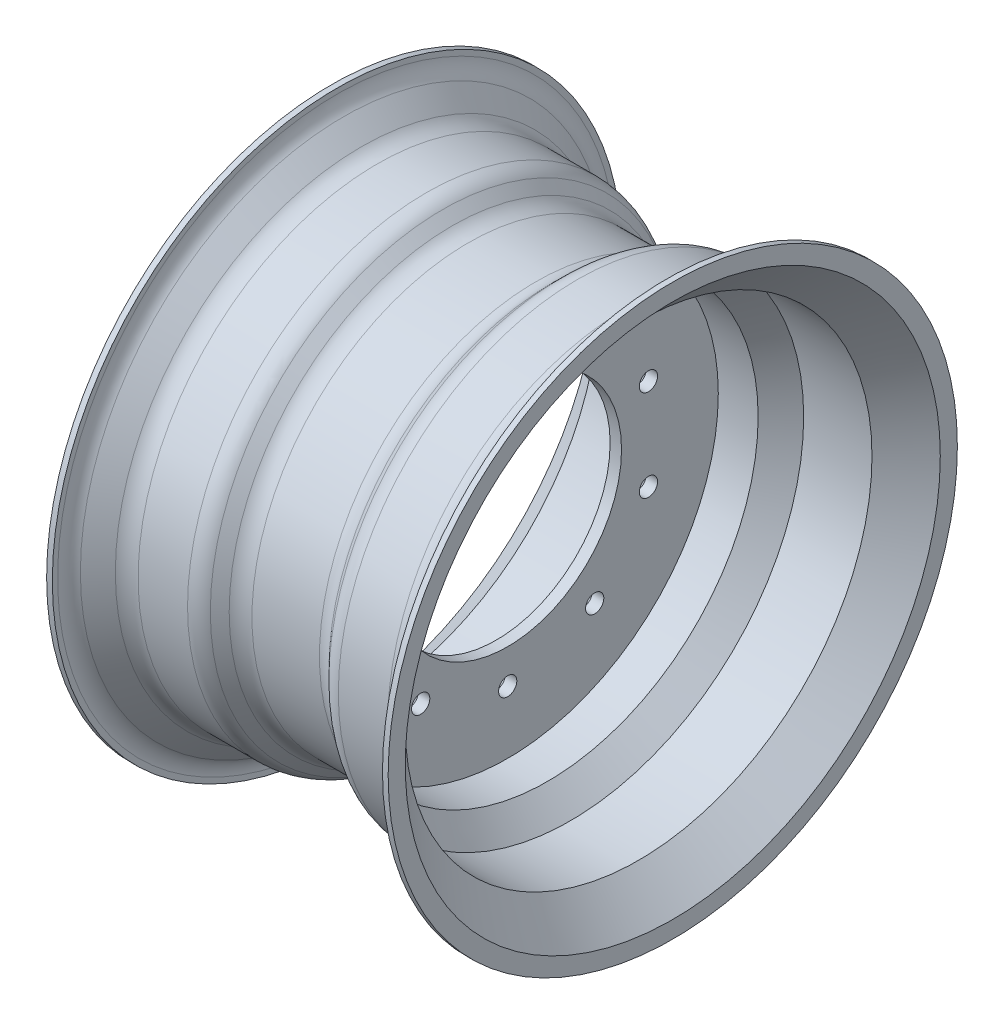
ISO-10303-21;
HEADER;
FILE_DESCRIPTION(('STEP AP214'),'2;1');
FILE_NAME('part.step','',(''),(''),'','','');
FILE_SCHEMA(('AUTOMOTIVE_DESIGN { 1 0 10303 214 1 1 1 1 }'));
ENDSEC;
DATA;
#1=APPLICATION_CONTEXT('core data for automotive mechanical design processes');
#2=APPLICATION_PROTOCOL_DEFINITION('international standard','automotive_design',2000,#1);
#3=PRODUCT_CONTEXT('',#1,'mechanical');
#4=PRODUCT('Part','Part','',(#3));
#5=PRODUCT_RELATED_PRODUCT_CATEGORY('part','',(#4));
#6=PRODUCT_DEFINITION_FORMATION('','',#4);
#7=PRODUCT_DEFINITION_CONTEXT('part definition',#1,'design');
#8=PRODUCT_DEFINITION('design','',#6,#7);
#9=PRODUCT_DEFINITION_SHAPE('','',#8);
#10=(LENGTH_UNIT() NAMED_UNIT(*) SI_UNIT(.MILLI.,.METRE.));
#11=(NAMED_UNIT(*) PLANE_ANGLE_UNIT() SI_UNIT($,.RADIAN.));
#12=(NAMED_UNIT(*) SI_UNIT($,.STERADIAN.) SOLID_ANGLE_UNIT());
#13=UNCERTAINTY_MEASURE_WITH_UNIT(LENGTH_MEASURE(1.E-05),#10,'distance_accuracy_value','');
#14=(GEOMETRIC_REPRESENTATION_CONTEXT(3) GLOBAL_UNCERTAINTY_ASSIGNED_CONTEXT((#13)) GLOBAL_UNIT_ASSIGNED_CONTEXT((#10,
#11,#12)) REPRESENTATION_CONTEXT('',''));
#15=CARTESIAN_POINT('',(0.,0.,0.));
#16=DIRECTION('',(0.,0.,1.));
#17=DIRECTION('',(1.,0.,0.));
#18=AXIS2_PLACEMENT_3D('',#15,#16,#17);
#19=CARTESIAN_POINT('',(-150.,235.,0.));
#20=DIRECTION('',(-1.,0.,0.));
#21=DIRECTION('',(0.,0.,1.));
#22=AXIS2_PLACEMENT_3D('',#19,#20,#21);
#23=PLANE('',#22);
#24=CARTESIAN_POINT('',(-150.,0.,0.));
#25=DIRECTION('',(1.,0.,0.));
#26=DIRECTION('',(0.,0.,-1.));
#27=AXIS2_PLACEMENT_3D('',#24,#25,#26);
#28=CIRCLE('',#27,235.);
#29=CARTESIAN_POINT('',(-150.,0.,-235.));
#30=VERTEX_POINT('',#29);
#31=EDGE_CURVE('E173',#30,#30,#28,.T.);
#32=ORIENTED_EDGE('',*,*,#31,.T.);
#33=EDGE_LOOP('',(#32));
#34=FACE_BOUND('',#33,.T.);
#35=CARTESIAN_POINT('',(-150.,0.,0.));
#36=DIRECTION('',(1.,0.,0.));
#37=DIRECTION('',(0.,0.,-1.));
#38=AXIS2_PLACEMENT_3D('',#35,#36,#37);
#39=CIRCLE('',#38,250.);
#40=CARTESIAN_POINT('',(-150.,0.,-250.));
#41=VERTEX_POINT('',#40);
#42=EDGE_CURVE('E113',#41,#41,#39,.T.);
#43=ORIENTED_EDGE('',*,*,#42,.F.);
#44=EDGE_LOOP('',(#43));
#45=FACE_BOUND('',#44,.T.);
#46=ADVANCED_FACE('F41',(#34,#45),#23,.T.);
#47=CARTESIAN_POINT('',(0.,0.,0.));
#48=DIRECTION('',(1.,0.,0.));
#49=DIRECTION('',(0.,0.,-1.));
#50=AXIS2_PLACEMENT_3D('',#47,#48,#49);
#51=CYLINDRICAL_SURFACE('',#50,250.);
#52=ORIENTED_EDGE('',*,*,#42,.T.);
#53=EDGE_LOOP('',(#52));
#54=FACE_BOUND('',#53,.T.);
#55=CARTESIAN_POINT('',(-145.,0.,0.));
#56=DIRECTION('',(1.,0.,0.));
#57=DIRECTION('',(0.,0.,-1.));
#58=AXIS2_PLACEMENT_3D('',#55,#56,#57);
#59=CIRCLE('',#58,250.);
#60=CARTESIAN_POINT('',(-145.,0.,-250.));
#61=VERTEX_POINT('',#60);
#62=EDGE_CURVE('E117',#61,#61,#59,.T.);
#63=ORIENTED_EDGE('',*,*,#62,.F.);
#64=EDGE_LOOP('',(#63));
#65=FACE_BOUND('',#64,.T.);
#66=ADVANCED_FACE('F322',(#54,#65),#51,.T.);
#67=CARTESIAN_POINT('',(-145.,237.071067811865,0.));
#68=DIRECTION('',(1.,0.,0.));
#69=DIRECTION('',(0.,0.,-1.));
#70=AXIS2_PLACEMENT_3D('',#67,#68,#69);
#71=PLANE('',#70);
#72=CARTESIAN_POINT('',(-145.,0.,0.));
#73=DIRECTION('',(1.,0.,0.));
#74=DIRECTION('',(0.,0.,-1.));
#75=AXIS2_PLACEMENT_3D('',#72,#73,#74);
#76=CIRCLE('',#75,245.355339059327);
#77=CARTESIAN_POINT('',(-145.,0.,-245.355339059327));
#78=VERTEX_POINT('',#77);
#79=EDGE_CURVE('E10',#78,#78,#76,.F.);
#80=ORIENTED_EDGE('',*,*,#79,.T.);
#81=EDGE_LOOP('',(#80));
#82=FACE_BOUND('',#81,.T.);
#83=ORIENTED_EDGE('',*,*,#62,.T.);
#84=EDGE_LOOP('',(#83));
#85=FACE_BOUND('',#84,.T.);
#86=ADVANCED_FACE('F328',(#82,#85),#71,.T.);
#87=CARTESIAN_POINT('',(-117.928932188134,0.,0.));
#88=DIRECTION('',(-1.,0.,0.));
#89=DIRECTION('',(0.,0.,1.));
#90=AXIS2_PLACEMENT_3D('',#87,#88,#89);
#91=CONICAL_SURFACE('',#90,210.,0.785398163397448);
#92=CARTESIAN_POINT('',(-123.786796564403,0.,0.));
#93=DIRECTION('',(-1.,0.,0.));
#94=DIRECTION('',(0.,0.,1.));
#95=AXIS2_PLACEMENT_3D('',#92,#93,#94);
#96=CIRCLE('',#95,215.857864376269);
#97=CARTESIAN_POINT('',(-123.786796564403,0.,215.857864376269));
#98=VERTEX_POINT('',#97);
#99=EDGE_CURVE('E49',#98,#98,#96,.T.);
#100=ORIENTED_EDGE('',*,*,#99,.T.);
#101=EDGE_LOOP('',(#100));
#102=FACE_BOUND('',#101,.T.);
#103=CARTESIAN_POINT('',(-139.142135623731,0.,0.));
#104=DIRECTION('',(-1.,0.,0.));
#105=DIRECTION('',(0.,0.,1.));
#106=AXIS2_PLACEMENT_3D('',#103,#104,#105);
#107=CIRCLE('',#106,231.213203435596);
#108=CARTESIAN_POINT('',(-139.142135623731,0.,231.213203435596));
#109=VERTEX_POINT('',#108);
#110=EDGE_CURVE('E54',#109,#109,#107,.F.);
#111=ORIENTED_EDGE('',*,*,#110,.T.);
#112=EDGE_LOOP('',(#111));
#113=FACE_BOUND('',#112,.T.);
#114=ADVANCED_FACE('F333',(#102,#113),#91,.T.);
#115=CARTESIAN_POINT('',(0.,0.,0.));
#116=DIRECTION('',(1.,0.,0.));
#117=DIRECTION('',(0.,0.,-1.));
#118=AXIS2_PLACEMENT_3D('',#115,#116,#117);
#119=CYLINDRICAL_SURFACE('',#118,210.);
#120=CARTESIAN_POINT('',(-66.2132034355964,0.,0.));
#121=DIRECTION('',(-1.,0.,0.));
#122=DIRECTION('',(0.,0.,1.));
#123=AXIS2_PLACEMENT_3D('',#120,#121,#122);
#124=CIRCLE('',#123,210.);
#125=CARTESIAN_POINT('',(-66.2132034355964,0.,210.));
#126=VERTEX_POINT('',#125);
#127=EDGE_CURVE('E59',#126,#126,#124,.T.);
#128=ORIENTED_EDGE('',*,*,#127,.T.);
#129=EDGE_LOOP('',(#128));
#130=FACE_BOUND('',#129,.T.);
#131=CARTESIAN_POINT('',(-109.644660940673,0.,0.));
#132=DIRECTION('',(1.,0.,0.));
#133=DIRECTION('',(0.,0.,-1.));
#134=AXIS2_PLACEMENT_3D('',#131,#132,#133);
#135=CIRCLE('',#134,210.);
#136=CARTESIAN_POINT('',(-109.644660940673,0.,-210.));
#137=VERTEX_POINT('',#136);
#138=EDGE_CURVE('E65',#137,#137,#135,.T.);
#139=ORIENTED_EDGE('',*,*,#138,.T.);
#140=EDGE_LOOP('',(#139));
#141=FACE_BOUND('',#140,.T.);
#142=ADVANCED_FACE('F338',(#130,#141),#119,.T.);
#143=CARTESIAN_POINT('',(-37.9289321881345,0.,0.));
#144=DIRECTION('',(-1.,0.,0.));
#145=DIRECTION('',(0.,0.,1.));
#146=AXIS2_PLACEMENT_3D('',#143,#144,#145);
#147=CONICAL_SURFACE('',#146,190.,0.785398163397448);
#148=CARTESIAN_POINT('',(-43.7867965644036,0.,0.));
#149=DIRECTION('',(-1.,0.,0.));
#150=DIRECTION('',(0.,0.,1.));
#151=AXIS2_PLACEMENT_3D('',#148,#149,#150);
#152=CIRCLE('',#151,195.857864376269);
#153=CARTESIAN_POINT('',(-43.7867965644036,0.,195.857864376269));
#154=VERTEX_POINT('',#153);
#155=EDGE_CURVE('E69',#154,#154,#152,.T.);
#156=ORIENTED_EDGE('',*,*,#155,.T.);
#157=EDGE_LOOP('',(#156));
#158=FACE_BOUND('',#157,.T.);
#159=CARTESIAN_POINT('',(-52.0710678118655,0.,0.));
#160=DIRECTION('',(1.,0.,0.));
#161=DIRECTION('',(0.,0.,-1.));
#162=AXIS2_PLACEMENT_3D('',#159,#160,#161);
#163=CIRCLE('',#162,204.142135623731);
#164=CARTESIAN_POINT('',(-52.0710678118655,0.,-204.142135623731));
#165=VERTEX_POINT('',#164);
#166=EDGE_CURVE('E73',#165,#165,#163,.T.);
#167=ORIENTED_EDGE('',*,*,#166,.T.);
#168=EDGE_LOOP('',(#167));
#169=FACE_BOUND('',#168,.T.);
#170=ADVANCED_FACE('F376',(#158,#169),#147,.T.);
#171=CARTESIAN_POINT('',(0.,0.,0.));
#172=DIRECTION('',(1.,0.,0.));
#173=DIRECTION('',(0.,0.,-1.));
#174=AXIS2_PLACEMENT_3D('',#171,#172,#173);
#175=CYLINDRICAL_SURFACE('',#174,190.);
#176=CARTESIAN_POINT('',(29.6446609406726,0.,0.));
#177=DIRECTION('',(1.,0.,0.));
#178=DIRECTION('',(0.,0.,-1.));
#179=AXIS2_PLACEMENT_3D('',#176,#177,#178);
#180=CIRCLE('',#179,190.);
#181=CARTESIAN_POINT('',(29.6446609406726,0.,-190.));
#182=VERTEX_POINT('',#181);
#183=EDGE_CURVE('E77',#182,#182,#180,.F.);
#184=ORIENTED_EDGE('',*,*,#183,.T.);
#185=EDGE_LOOP('',(#184));
#186=FACE_BOUND('',#185,.T.);
#187=CARTESIAN_POINT('',(-29.6446609406726,0.,0.));
#188=DIRECTION('',(1.,0.,0.));
#189=DIRECTION('',(0.,0.,-1.));
#190=AXIS2_PLACEMENT_3D('',#187,#188,#189);
#191=CIRCLE('',#190,190.);
#192=CARTESIAN_POINT('',(-29.6446609406726,0.,-190.));
#193=VERTEX_POINT('',#192);
#194=EDGE_CURVE('E81',#193,#193,#191,.T.);
#195=ORIENTED_EDGE('',*,*,#194,.T.);
#196=EDGE_LOOP('',(#195));
#197=FACE_BOUND('',#196,.T.);
#198=ADVANCED_FACE('F381',(#186,#197),#175,.T.);
#199=CARTESIAN_POINT('',(57.9289321881345,0.,0.));
#200=DIRECTION('',(1.,0.,0.));
#201=DIRECTION('',(0.,0.,-1.));
#202=AXIS2_PLACEMENT_3D('',#199,#200,#201);
#203=CONICAL_SURFACE('',#202,210.,0.785398163397448);
#204=CARTESIAN_POINT('',(52.0710678118655,0.,0.));
#205=DIRECTION('',(-1.,0.,0.));
#206=DIRECTION('',(0.,0.,1.));
#207=AXIS2_PLACEMENT_3D('',#204,#205,#206);
#208=CIRCLE('',#207,204.142135623731);
#209=CARTESIAN_POINT('',(52.0710678118655,0.,204.142135623731));
#210=VERTEX_POINT('',#209);
#211=EDGE_CURVE('E85',#210,#210,#208,.T.);
#212=ORIENTED_EDGE('',*,*,#211,.T.);
#213=EDGE_LOOP('',(#212));
#214=FACE_BOUND('',#213,.T.);
#215=CARTESIAN_POINT('',(43.7867965644035,0.,0.));
#216=DIRECTION('',(1.,0.,0.));
#217=DIRECTION('',(0.,0.,-1.));
#218=AXIS2_PLACEMENT_3D('',#215,#216,#217);
#219=CIRCLE('',#218,195.857864376269);
#220=CARTESIAN_POINT('',(43.7867965644035,0.,-195.857864376269));
#221=VERTEX_POINT('',#220);
#222=EDGE_CURVE('E89',#221,#221,#219,.T.);
#223=ORIENTED_EDGE('',*,*,#222,.T.);
#224=EDGE_LOOP('',(#223));
#225=FACE_BOUND('',#224,.T.);
#226=ADVANCED_FACE('F387',(#214,#225),#203,.T.);
#227=CARTESIAN_POINT('',(0.,0.,0.));
#228=DIRECTION('',(1.,0.,0.));
#229=DIRECTION('',(0.,0.,-1.));
#230=AXIS2_PLACEMENT_3D('',#227,#228,#229);
#231=CYLINDRICAL_SURFACE('',#230,210.);
#232=CARTESIAN_POINT('',(109.644660940673,0.,0.));
#233=DIRECTION('',(1.,0.,0.));
#234=DIRECTION('',(0.,0.,-1.));
#235=AXIS2_PLACEMENT_3D('',#232,#233,#234);
#236=CIRCLE('',#235,210.);
#237=CARTESIAN_POINT('',(109.644660940673,0.,-210.));
#238=VERTEX_POINT('',#237);
#239=EDGE_CURVE('E93',#238,#238,#236,.F.);
#240=ORIENTED_EDGE('',*,*,#239,.T.);
#241=EDGE_LOOP('',(#240));
#242=FACE_BOUND('',#241,.T.);
#243=CARTESIAN_POINT('',(66.2132034355964,0.,0.));
#244=DIRECTION('',(-1.,0.,0.));
#245=DIRECTION('',(0.,0.,1.));
#246=AXIS2_PLACEMENT_3D('',#243,#244,#245);
#247=CIRCLE('',#246,210.);
#248=CARTESIAN_POINT('',(66.2132034355964,0.,210.));
#249=VERTEX_POINT('',#248);
#250=EDGE_CURVE('E97',#249,#249,#247,.F.);
#251=ORIENTED_EDGE('',*,*,#250,.T.);
#252=EDGE_LOOP('',(#251));
#253=FACE_BOUND('',#252,.T.);
#254=ADVANCED_FACE('F391',(#242,#253),#231,.T.);
#255=CARTESIAN_POINT('',(145.,0.,0.));
#256=DIRECTION('',(1.,0.,0.));
#257=DIRECTION('',(0.,0.,-1.));
#258=AXIS2_PLACEMENT_3D('',#255,#256,#257);
#259=CONICAL_SURFACE('',#258,237.071067811865,0.785398163397448);
#260=CARTESIAN_POINT('',(139.142135623731,0.,0.));
#261=DIRECTION('',(1.,0.,0.));
#262=DIRECTION('',(0.,0.,-1.));
#263=AXIS2_PLACEMENT_3D('',#260,#261,#262);
#264=CIRCLE('',#263,231.213203435596);
#265=CARTESIAN_POINT('',(139.142135623731,0.,-231.213203435596));
#266=VERTEX_POINT('',#265);
#267=EDGE_CURVE('E101',#266,#266,#264,.F.);
#268=ORIENTED_EDGE('',*,*,#267,.T.);
#269=EDGE_LOOP('',(#268));
#270=FACE_BOUND('',#269,.T.);
#271=CARTESIAN_POINT('',(123.786796564403,0.,0.));
#272=DIRECTION('',(1.,0.,0.));
#273=DIRECTION('',(0.,0.,-1.));
#274=AXIS2_PLACEMENT_3D('',#271,#272,#273);
#275=CIRCLE('',#274,215.857864376269);
#276=CARTESIAN_POINT('',(123.786796564403,0.,-215.857864376269));
#277=VERTEX_POINT('',#276);
#278=EDGE_CURVE('E105',#277,#277,#275,.T.);
#279=ORIENTED_EDGE('',*,*,#278,.T.);
#280=EDGE_LOOP('',(#279));
#281=FACE_BOUND('',#280,.T.);
#282=ADVANCED_FACE('F395',(#270,#281),#259,.T.);
#283=CARTESIAN_POINT('',(145.,237.071067811865,0.));
#284=DIRECTION('',(-1.,0.,0.));
#285=DIRECTION('',(0.,0.,1.));
#286=AXIS2_PLACEMENT_3D('',#283,#284,#285);
#287=PLANE('',#286);
#288=CARTESIAN_POINT('',(145.,0.,0.));
#289=DIRECTION('',(-1.,0.,0.));
#290=DIRECTION('',(0.,0.,1.));
#291=AXIS2_PLACEMENT_3D('',#288,#289,#290);
#292=CIRCLE('',#291,245.355339059327);
#293=CARTESIAN_POINT('',(145.,0.,245.355339059327));
#294=VERTEX_POINT('',#293);
#295=EDGE_CURVE('E109',#294,#294,#292,.F.);
#296=ORIENTED_EDGE('',*,*,#295,.T.);
#297=EDGE_LOOP('',(#296));
#298=FACE_BOUND('',#297,.T.);
#299=CARTESIAN_POINT('',(145.,0.,0.));
#300=DIRECTION('',(1.,0.,0.));
#301=DIRECTION('',(0.,0.,-1.));
#302=AXIS2_PLACEMENT_3D('',#299,#300,#301);
#303=CIRCLE('',#302,250.);
#304=CARTESIAN_POINT('',(145.,0.,-250.));
#305=VERTEX_POINT('',#304);
#306=EDGE_CURVE('E121',#305,#305,#303,.T.);
#307=ORIENTED_EDGE('',*,*,#306,.F.);
#308=EDGE_LOOP('',(#307));
#309=FACE_BOUND('',#308,.T.);
#310=ADVANCED_FACE('F399',(#298,#309),#287,.T.);
#311=CARTESIAN_POINT('',(0.,0.,0.));
#312=DIRECTION('',(1.,0.,0.));
#313=DIRECTION('',(0.,0.,-1.));
#314=AXIS2_PLACEMENT_3D('',#311,#312,#313);
#315=CYLINDRICAL_SURFACE('',#314,250.);
#316=ORIENTED_EDGE('',*,*,#306,.T.);
#317=EDGE_LOOP('',(#316));
#318=FACE_BOUND('',#317,.T.);
#319=CARTESIAN_POINT('',(150.,0.,0.));
#320=DIRECTION('',(1.,0.,0.));
#321=DIRECTION('',(0.,0.,-1.));
#322=AXIS2_PLACEMENT_3D('',#319,#320,#321);
#323=CIRCLE('',#322,250.);
#324=CARTESIAN_POINT('',(150.,0.,-250.));
#325=VERTEX_POINT('',#324);
#326=EDGE_CURVE('E125',#325,#325,#323,.T.);
#327=ORIENTED_EDGE('',*,*,#326,.F.);
#328=EDGE_LOOP('',(#327));
#329=FACE_BOUND('',#328,.T.);
#330=ADVANCED_FACE('F403',(#318,#329),#315,.T.);
#331=CARTESIAN_POINT('',(150.,235.,0.));
#332=DIRECTION('',(1.,0.,0.));
#333=DIRECTION('',(0.,0.,-1.));
#334=AXIS2_PLACEMENT_3D('',#331,#332,#333);
#335=PLANE('',#334);
#336=ORIENTED_EDGE('',*,*,#326,.T.);
#337=EDGE_LOOP('',(#336));
#338=FACE_BOUND('',#337,.T.);
#339=CARTESIAN_POINT('',(150.,0.,0.));
#340=DIRECTION('',(1.,0.,0.));
#341=DIRECTION('',(0.,0.,-1.));
#342=AXIS2_PLACEMENT_3D('',#339,#340,#341);
#343=CIRCLE('',#342,235.);
#344=CARTESIAN_POINT('',(150.,0.,-235.));
#345=VERTEX_POINT('',#344);
#346=EDGE_CURVE('E129',#345,#345,#343,.T.);
#347=ORIENTED_EDGE('',*,*,#346,.F.);
#348=EDGE_LOOP('',(#347));
#349=FACE_BOUND('',#348,.T.);
#350=ADVANCED_FACE('F407',(#338,#349),#335,.T.);
#351=CARTESIAN_POINT('',(120.,0.,0.));
#352=DIRECTION('',(1.,0.,0.));
#353=DIRECTION('',(0.,0.,-1.));
#354=AXIS2_PLACEMENT_3D('',#351,#352,#353);
#355=CONICAL_SURFACE('',#354,205.,0.78539816339745);
#356=ORIENTED_EDGE('',*,*,#346,.T.);
#357=EDGE_LOOP('',(#356));
#358=FACE_BOUND('',#357,.T.);
#359=CARTESIAN_POINT('',(120.,0.,0.));
#360=DIRECTION('',(1.,0.,0.));
#361=DIRECTION('',(0.,0.,-1.));
#362=AXIS2_PLACEMENT_3D('',#359,#360,#361);
#363=CIRCLE('',#362,205.);
#364=CARTESIAN_POINT('',(120.,0.,-205.));
#365=VERTEX_POINT('',#364);
#366=EDGE_CURVE('E133',#365,#365,#363,.T.);
#367=ORIENTED_EDGE('',*,*,#366,.F.);
#368=EDGE_LOOP('',(#367));
#369=FACE_BOUND('',#368,.T.);
#370=ADVANCED_FACE('F411',(#358,#369),#355,.F.);
#371=CARTESIAN_POINT('',(0.,0.,0.));
#372=DIRECTION('',(1.,0.,0.));
#373=DIRECTION('',(0.,0.,-1.));
#374=AXIS2_PLACEMENT_3D('',#371,#372,#373);
#375=CYLINDRICAL_SURFACE('',#374,205.);
#376=ORIENTED_EDGE('',*,*,#366,.T.);
#377=EDGE_LOOP('',(#376));
#378=FACE_BOUND('',#377,.T.);
#379=CARTESIAN_POINT('',(60.,0.,0.));
#380=DIRECTION('',(1.,0.,0.));
#381=DIRECTION('',(0.,0.,-1.));
#382=AXIS2_PLACEMENT_3D('',#379,#380,#381);
#383=CIRCLE('',#382,205.);
#384=CARTESIAN_POINT('',(60.,0.,-205.));
#385=VERTEX_POINT('',#384);
#386=EDGE_CURVE('E137',#385,#385,#383,.T.);
#387=ORIENTED_EDGE('',*,*,#386,.F.);
#388=EDGE_LOOP('',(#387));
#389=FACE_BOUND('',#388,.T.);
#390=ADVANCED_FACE('F415',(#378,#389),#375,.F.);
#391=CARTESIAN_POINT('',(40.,0.,0.));
#392=DIRECTION('',(1.,0.,0.));
#393=DIRECTION('',(0.,0.,-1.));
#394=AXIS2_PLACEMENT_3D('',#391,#392,#393);
#395=CONICAL_SURFACE('',#394,185.,0.785398163397449);
#396=ORIENTED_EDGE('',*,*,#386,.T.);
#397=EDGE_LOOP('',(#396));
#398=FACE_BOUND('',#397,.T.);
#399=CARTESIAN_POINT('',(40.,0.,0.));
#400=DIRECTION('',(1.,0.,0.));
#401=DIRECTION('',(0.,0.,-1.));
#402=AXIS2_PLACEMENT_3D('',#399,#400,#401);
#403=CIRCLE('',#402,185.);
#404=CARTESIAN_POINT('',(40.,0.,-185.));
#405=VERTEX_POINT('',#404);
#406=EDGE_CURVE('E141',#405,#405,#403,.T.);
#407=ORIENTED_EDGE('',*,*,#406,.F.);
#408=EDGE_LOOP('',(#407));
#409=FACE_BOUND('',#408,.T.);
#410=ADVANCED_FACE('F419',(#398,#409),#395,.F.);
#411=CARTESIAN_POINT('',(0.,0.,0.));
#412=DIRECTION('',(1.,0.,0.));
#413=DIRECTION('',(0.,0.,-1.));
#414=AXIS2_PLACEMENT_3D('',#411,#412,#413);
#415=CYLINDRICAL_SURFACE('',#414,185.);
#416=ORIENTED_EDGE('',*,*,#406,.T.);
#417=EDGE_LOOP('',(#416));
#418=FACE_BOUND('',#417,.T.);
#419=CARTESIAN_POINT('',(5.00000000000001,0.,0.));
#420=DIRECTION('',(1.,0.,0.));
#421=DIRECTION('',(0.,0.,-1.));
#422=AXIS2_PLACEMENT_3D('',#419,#420,#421);
#423=CIRCLE('',#422,185.);
#424=CARTESIAN_POINT('',(5.00000000000001,0.,-185.));
#425=VERTEX_POINT('',#424);
#426=EDGE_CURVE('E145',#425,#425,#423,.T.);
#427=ORIENTED_EDGE('',*,*,#426,.F.);
#428=EDGE_LOOP('',(#427));
#429=FACE_BOUND('',#428,.T.);
#430=ADVANCED_FACE('F273',(#418,#429),#415,.F.);
#431=CARTESIAN_POINT('',(5.00000000000001,185.,0.));
#432=DIRECTION('',(1.,0.,0.));
#433=DIRECTION('',(0.,0.,-1.));
#434=AXIS2_PLACEMENT_3D('',#431,#432,#433);
#435=PLANE('',#434);
#436=CARTESIAN_POINT('',(5.00000000000001,105.172209268744,-76.4120827980201));
#437=DIRECTION('',(1.,0.,0.));
#438=DIRECTION('',(0.,-0.587785252292462,-0.809016994374955));
#439=AXIS2_PLACEMENT_3D('',#436,#437,#438);
#440=CIRCLE('',#439,8.);
#441=CARTESIAN_POINT('',(5.00000000000001,100.469927250404,-82.8842187530198));
#442=VERTEX_POINT('',#441);
#443=EDGE_CURVE('E194',#442,#442,#440,.T.);
#444=ORIENTED_EDGE('',*,*,#443,.F.);
#445=EDGE_LOOP('',(#444));
#446=FACE_BOUND('',#445,.T.);
#447=CARTESIAN_POINT('',(5.00000000000001,40.1722092687446,-123.63734711837));
#448=DIRECTION('',(1.,0.,0.));
#449=DIRECTION('',(0.,-0.95105651629515,-0.309016994374958));
#450=AXIS2_PLACEMENT_3D('',#447,#448,#449);
#451=CIRCLE('',#450,8.);
#452=CARTESIAN_POINT('',(5.00000000000001,32.5637571383834,-126.109483073369));
#453=VERTEX_POINT('',#452);
#454=EDGE_CURVE('E202',#453,#453,#451,.T.);
#455=ORIENTED_EDGE('',*,*,#454,.F.);
#456=EDGE_LOOP('',(#455));
#457=FACE_BOUND('',#456,.T.);
#458=CARTESIAN_POINT('',(5.00000000000001,-40.172209268742,-123.63734711837));
#459=DIRECTION('',(1.,0.,0.));
#460=DIRECTION('',(0.,-0.951056516295157,0.309016994374938));
#461=AXIS2_PLACEMENT_3D('',#458,#459,#460);
#462=CIRCLE('',#461,8.);
#463=CARTESIAN_POINT('',(5.00000000000001,-47.7806613991032,-121.165211163371));
#464=VERTEX_POINT('',#463);
#465=EDGE_CURVE('E210',#464,#464,#462,.T.);
#466=ORIENTED_EDGE('',*,*,#465,.F.);
#467=EDGE_LOOP('',(#466));
#468=FACE_BOUND('',#467,.T.);
#469=CARTESIAN_POINT('',(5.00000000000001,-105.172209268742,-76.4120827980224));
#470=DIRECTION('',(1.,0.,0.));
#471=DIRECTION('',(0.,-0.58778525229248,0.809016994374942));
#472=AXIS2_PLACEMENT_3D('',#469,#470,#471);
#473=CIRCLE('',#472,8.);
#474=CARTESIAN_POINT('',(5.00000000000001,-109.874491287082,-69.9399468430229));
#475=VERTEX_POINT('',#474);
#476=EDGE_CURVE('E218',#475,#475,#473,.T.);
#477=ORIENTED_EDGE('',*,*,#476,.F.);
#478=EDGE_LOOP('',(#477));
#479=FACE_BOUND('',#478,.T.);
#480=CARTESIAN_POINT('',(5.00000000000001,-130.,0.));
#481=DIRECTION('',(1.,0.,0.));
#482=DIRECTION('',(0.,0.,1.));
#483=AXIS2_PLACEMENT_3D('',#480,#481,#482);
#484=CIRCLE('',#483,8.);
#485=CARTESIAN_POINT('',(5.00000000000001,-130.,8.));
#486=VERTEX_POINT('',#485);
#487=EDGE_CURVE('E226',#486,#486,#484,.T.);
#488=ORIENTED_EDGE('',*,*,#487,.F.);
#489=EDGE_LOOP('',(#488));
#490=FACE_BOUND('',#489,.T.);
#491=CARTESIAN_POINT('',(5.00000000000001,-105.172209268744,76.4120827980209));
#492=DIRECTION('',(1.,0.,0.));
#493=DIRECTION('',(0.,0.587785252292469,0.809016994374951));
#494=AXIS2_PLACEMENT_3D('',#491,#492,#493);
#495=CIRCLE('',#494,8.);
#496=CARTESIAN_POINT('',(5.00000000000001,-100.469927250404,82.8842187530205));
#497=VERTEX_POINT('',#496);
#498=EDGE_CURVE('E234',#497,#497,#495,.T.);
#499=ORIENTED_EDGE('',*,*,#498,.F.);
#500=EDGE_LOOP('',(#499));
#501=FACE_BOUND('',#500,.T.);
#502=CARTESIAN_POINT('',(5.00000000000001,-40.1722092687437,123.63734711837));
#503=DIRECTION('',(1.,0.,0.));
#504=DIRECTION('',(0.,0.951056516295152,0.309016994374952));
#505=AXIS2_PLACEMENT_3D('',#502,#503,#504);
#506=CIRCLE('',#505,8.);
#507=CARTESIAN_POINT('',(5.00000000000001,-32.5637571383825,126.109483073369));
#508=VERTEX_POINT('',#507);
#509=EDGE_CURVE('E242',#508,#508,#506,.T.);
#510=ORIENTED_EDGE('',*,*,#509,.F.);
#511=EDGE_LOOP('',(#510));
#512=FACE_BOUND('',#511,.T.);
#513=CARTESIAN_POINT('',(5.00000000000001,40.1722092687428,123.63734711837));
#514=DIRECTION('',(1.,0.,0.));
#515=DIRECTION('',(0.,0.951056516295155,-0.309016994374945));
#516=AXIS2_PLACEMENT_3D('',#513,#514,#515);
#517=CIRCLE('',#516,8.);
#518=CARTESIAN_POINT('',(5.00000000000001,47.7806613991041,121.165211163371));
#519=VERTEX_POINT('',#518);
#520=EDGE_CURVE('E250',#519,#519,#517,.T.);
#521=ORIENTED_EDGE('',*,*,#520,.F.);
#522=EDGE_LOOP('',(#521));
#523=FACE_BOUND('',#522,.T.);
#524=CARTESIAN_POINT('',(5.00000000000001,105.172209268743,76.4120827980217));
#525=DIRECTION('',(1.,0.,0.));
#526=DIRECTION('',(0.,0.587785252292474,-0.809016994374947));
#527=AXIS2_PLACEMENT_3D('',#524,#525,#526);
#528=CIRCLE('',#527,8.);
#529=CARTESIAN_POINT('',(5.00000000000001,109.874491287083,69.9399468430221));
#530=VERTEX_POINT('',#529);
#531=EDGE_CURVE('E186',#530,#530,#528,.T.);
#532=ORIENTED_EDGE('',*,*,#531,.F.);
#533=EDGE_LOOP('',(#532));
#534=FACE_BOUND('',#533,.T.);
#535=CARTESIAN_POINT('',(5.00000000000001,130.,0.));
#536=DIRECTION('',(1.,0.,0.));
#537=DIRECTION('',(0.,0.,-1.));
#538=AXIS2_PLACEMENT_3D('',#535,#536,#537);
#539=CIRCLE('',#538,8.);
#540=CARTESIAN_POINT('',(5.00000000000001,130.,-8.));
#541=VERTEX_POINT('',#540);
#542=EDGE_CURVE('E178',#541,#541,#539,.T.);
#543=ORIENTED_EDGE('',*,*,#542,.F.);
#544=EDGE_LOOP('',(#543));
#545=FACE_BOUND('',#544,.T.);
#546=ORIENTED_EDGE('',*,*,#426,.T.);
#547=EDGE_LOOP('',(#546));
#548=FACE_BOUND('',#547,.T.);
#549=CARTESIAN_POINT('',(5.00000000000002,0.,0.));
#550=DIRECTION('',(1.,0.,0.));
#551=DIRECTION('',(0.,0.,-1.));
#552=AXIS2_PLACEMENT_3D('',#549,#550,#551);
#553=CIRCLE('',#552,100.);
#554=CARTESIAN_POINT('',(5.00000000000002,0.,-100.));
#555=VERTEX_POINT('',#554);
#556=EDGE_CURVE('E149',#555,#555,#553,.T.);
#557=ORIENTED_EDGE('',*,*,#556,.F.);
#558=EDGE_LOOP('',(#557));
#559=FACE_BOUND('',#558,.T.);
#560=ADVANCED_FACE('F269',(#446,#457,#468,#479,#490,#501,#512,#523,#534,#545,#548,#559),#435,.T.);
#561=CARTESIAN_POINT('',(0.,0.,0.));
#562=DIRECTION('',(1.,0.,0.));
#563=DIRECTION('',(0.,0.,-1.));
#564=AXIS2_PLACEMENT_3D('',#561,#562,#563);
#565=CYLINDRICAL_SURFACE('',#564,100.);
#566=ORIENTED_EDGE('',*,*,#556,.T.);
#567=EDGE_LOOP('',(#566));
#568=FACE_BOUND('',#567,.T.);
#569=CARTESIAN_POINT('',(-4.99999999999998,0.,0.));
#570=DIRECTION('',(1.,0.,0.));
#571=DIRECTION('',(0.,0.,-1.));
#572=AXIS2_PLACEMENT_3D('',#569,#570,#571);
#573=CIRCLE('',#572,100.);
#574=CARTESIAN_POINT('',(-4.99999999999998,0.,-100.));
#575=VERTEX_POINT('',#574);
#576=EDGE_CURVE('E153',#575,#575,#573,.T.);
#577=ORIENTED_EDGE('',*,*,#576,.F.);
#578=EDGE_LOOP('',(#577));
#579=FACE_BOUND('',#578,.T.);
#580=ADVANCED_FACE('F272',(#568,#579),#565,.F.);
#581=CARTESIAN_POINT('',(-4.99999999999999,185.,0.));
#582=DIRECTION('',(-1.,0.,0.));
#583=DIRECTION('',(0.,0.,1.));
#584=AXIS2_PLACEMENT_3D('',#581,#582,#583);
#585=PLANE('',#584);
#586=CARTESIAN_POINT('',(-4.99999999999999,105.172209268744,-76.4120827980201));
#587=DIRECTION('',(1.,0.,0.));
#588=DIRECTION('',(0.,-0.587785252292462,-0.809016994374955));
#589=AXIS2_PLACEMENT_3D('',#586,#587,#588);
#590=CIRCLE('',#589,8.);
#591=CARTESIAN_POINT('',(-4.99999999999999,100.469927250404,-82.8842187530198));
#592=VERTEX_POINT('',#591);
#593=EDGE_CURVE('E198',#592,#592,#590,.T.);
#594=ORIENTED_EDGE('',*,*,#593,.T.);
#595=EDGE_LOOP('',(#594));
#596=FACE_BOUND('',#595,.T.);
#597=CARTESIAN_POINT('',(-4.99999999999999,40.1722092687446,-123.63734711837));
#598=DIRECTION('',(1.,0.,0.));
#599=DIRECTION('',(0.,-0.95105651629515,-0.309016994374958));
#600=AXIS2_PLACEMENT_3D('',#597,#598,#599);
#601=CIRCLE('',#600,8.);
#602=CARTESIAN_POINT('',(-4.99999999999999,32.5637571383834,-126.109483073369));
#603=VERTEX_POINT('',#602);
#604=EDGE_CURVE('E206',#603,#603,#601,.T.);
#605=ORIENTED_EDGE('',*,*,#604,.T.);
#606=EDGE_LOOP('',(#605));
#607=FACE_BOUND('',#606,.T.);
#608=CARTESIAN_POINT('',(-4.99999999999999,-40.172209268742,-123.63734711837));
#609=DIRECTION('',(1.,0.,0.));
#610=DIRECTION('',(0.,-0.951056516295157,0.309016994374938));
#611=AXIS2_PLACEMENT_3D('',#608,#609,#610);
#612=CIRCLE('',#611,8.);
#613=CARTESIAN_POINT('',(-4.99999999999999,-47.7806613991032,-121.165211163371));
#614=VERTEX_POINT('',#613);
#615=EDGE_CURVE('E214',#614,#614,#612,.T.);
#616=ORIENTED_EDGE('',*,*,#615,.T.);
#617=EDGE_LOOP('',(#616));
#618=FACE_BOUND('',#617,.T.);
#619=CARTESIAN_POINT('',(-4.99999999999999,-105.172209268742,-76.4120827980224));
#620=DIRECTION('',(1.,0.,0.));
#621=DIRECTION('',(0.,-0.58778525229248,0.809016994374942));
#622=AXIS2_PLACEMENT_3D('',#619,#620,#621);
#623=CIRCLE('',#622,8.);
#624=CARTESIAN_POINT('',(-4.99999999999999,-109.874491287082,-69.9399468430229));
#625=VERTEX_POINT('',#624);
#626=EDGE_CURVE('E222',#625,#625,#623,.T.);
#627=ORIENTED_EDGE('',*,*,#626,.T.);
#628=EDGE_LOOP('',(#627));
#629=FACE_BOUND('',#628,.T.);
#630=CARTESIAN_POINT('',(-4.99999999999999,-130.,0.));
#631=DIRECTION('',(1.,0.,0.));
#632=DIRECTION('',(0.,0.,1.));
#633=AXIS2_PLACEMENT_3D('',#630,#631,#632);
#634=CIRCLE('',#633,8.);
#635=CARTESIAN_POINT('',(-4.99999999999999,-130.,8.));
#636=VERTEX_POINT('',#635);
#637=EDGE_CURVE('E230',#636,#636,#634,.T.);
#638=ORIENTED_EDGE('',*,*,#637,.T.);
#639=EDGE_LOOP('',(#638));
#640=FACE_BOUND('',#639,.T.);
#641=CARTESIAN_POINT('',(-4.99999999999999,-105.172209268744,76.4120827980209));
#642=DIRECTION('',(1.,0.,0.));
#643=DIRECTION('',(0.,0.587785252292469,0.809016994374951));
#644=AXIS2_PLACEMENT_3D('',#641,#642,#643);
#645=CIRCLE('',#644,8.);
#646=CARTESIAN_POINT('',(-4.99999999999999,-100.469927250404,82.8842187530205));
#647=VERTEX_POINT('',#646);
#648=EDGE_CURVE('E238',#647,#647,#645,.T.);
#649=ORIENTED_EDGE('',*,*,#648,.T.);
#650=EDGE_LOOP('',(#649));
#651=FACE_BOUND('',#650,.T.);
#652=CARTESIAN_POINT('',(-4.99999999999999,-40.1722092687437,123.63734711837));
#653=DIRECTION('',(1.,0.,0.));
#654=DIRECTION('',(0.,0.951056516295152,0.309016994374952));
#655=AXIS2_PLACEMENT_3D('',#652,#653,#654);
#656=CIRCLE('',#655,8.);
#657=CARTESIAN_POINT('',(-4.99999999999999,-32.5637571383825,126.109483073369));
#658=VERTEX_POINT('',#657);
#659=EDGE_CURVE('E246',#658,#658,#656,.T.);
#660=ORIENTED_EDGE('',*,*,#659,.T.);
#661=EDGE_LOOP('',(#660));
#662=FACE_BOUND('',#661,.T.);
#663=CARTESIAN_POINT('',(-4.99999999999999,40.1722092687428,123.63734711837));
#664=DIRECTION('',(1.,0.,0.));
#665=DIRECTION('',(0.,0.951056516295155,-0.309016994374945));
#666=AXIS2_PLACEMENT_3D('',#663,#664,#665);
#667=CIRCLE('',#666,8.);
#668=CARTESIAN_POINT('',(-4.99999999999999,47.7806613991041,121.165211163371));
#669=VERTEX_POINT('',#668);
#670=EDGE_CURVE('E190',#669,#669,#667,.T.);
#671=ORIENTED_EDGE('',*,*,#670,.T.);
#672=EDGE_LOOP('',(#671));
#673=FACE_BOUND('',#672,.T.);
#674=CARTESIAN_POINT('',(-4.99999999999999,105.172209268743,76.4120827980217));
#675=DIRECTION('',(1.,0.,0.));
#676=DIRECTION('',(0.,0.587785252292474,-0.809016994374947));
#677=AXIS2_PLACEMENT_3D('',#674,#675,#676);
#678=CIRCLE('',#677,8.);
#679=CARTESIAN_POINT('',(-4.99999999999999,109.874491287083,69.9399468430221));
#680=VERTEX_POINT('',#679);
#681=EDGE_CURVE('E182',#680,#680,#678,.T.);
#682=ORIENTED_EDGE('',*,*,#681,.T.);
#683=EDGE_LOOP('',(#682));
#684=FACE_BOUND('',#683,.T.);
#685=CARTESIAN_POINT('',(-4.99999999999999,130.,0.));
#686=DIRECTION('',(1.,0.,0.));
#687=DIRECTION('',(0.,0.,-1.));
#688=AXIS2_PLACEMENT_3D('',#685,#686,#687);
#689=CIRCLE('',#688,8.);
#690=CARTESIAN_POINT('',(-4.99999999999999,130.,-8.));
#691=VERTEX_POINT('',#690);
#692=EDGE_CURVE('E177',#691,#691,#689,.T.);
#693=ORIENTED_EDGE('',*,*,#692,.T.);
#694=EDGE_LOOP('',(#693));
#695=FACE_BOUND('',#694,.T.);
#696=ORIENTED_EDGE('',*,*,#576,.T.);
#697=EDGE_LOOP('',(#696));
#698=FACE_BOUND('',#697,.T.);
#699=CARTESIAN_POINT('',(-4.99999999999999,0.,0.));
#700=DIRECTION('',(1.,0.,0.));
#701=DIRECTION('',(0.,0.,-1.));
#702=AXIS2_PLACEMENT_3D('',#699,#700,#701);
#703=CIRCLE('',#702,185.);
#704=CARTESIAN_POINT('',(-4.99999999999999,0.,-185.));
#705=VERTEX_POINT('',#704);
#706=EDGE_CURVE('E157',#705,#705,#703,.T.);
#707=ORIENTED_EDGE('',*,*,#706,.F.);
#708=EDGE_LOOP('',(#707));
#709=FACE_BOUND('',#708,.T.);
#710=ADVANCED_FACE('F258',(#596,#607,#618,#629,#640,#651,#662,#673,#684,#695,#698,#709),#585,.T.);
#711=CARTESIAN_POINT('',(0.,0.,0.));
#712=DIRECTION('',(1.,0.,0.));
#713=DIRECTION('',(0.,0.,-1.));
#714=AXIS2_PLACEMENT_3D('',#711,#712,#713);
#715=CYLINDRICAL_SURFACE('',#714,185.);
#716=ORIENTED_EDGE('',*,*,#706,.T.);
#717=EDGE_LOOP('',(#716));
#718=FACE_BOUND('',#717,.T.);
#719=CARTESIAN_POINT('',(-40.,0.,0.));
#720=DIRECTION('',(1.,0.,0.));
#721=DIRECTION('',(0.,0.,-1.));
#722=AXIS2_PLACEMENT_3D('',#719,#720,#721);
#723=CIRCLE('',#722,185.);
#724=CARTESIAN_POINT('',(-40.,0.,-185.));
#725=VERTEX_POINT('',#724);
#726=EDGE_CURVE('E161',#725,#725,#723,.T.);
#727=ORIENTED_EDGE('',*,*,#726,.F.);
#728=EDGE_LOOP('',(#727));
#729=FACE_BOUND('',#728,.T.);
#730=ADVANCED_FACE('F291',(#718,#729),#715,.F.);
#731=CARTESIAN_POINT('',(-60.,0.,0.));
#732=DIRECTION('',(-1.,0.,0.));
#733=DIRECTION('',(0.,0.,1.));
#734=AXIS2_PLACEMENT_3D('',#731,#732,#733);
#735=CONICAL_SURFACE('',#734,205.,0.785398163397449);
#736=ORIENTED_EDGE('',*,*,#726,.T.);
#737=EDGE_LOOP('',(#736));
#738=FACE_BOUND('',#737,.T.);
#739=CARTESIAN_POINT('',(-60.,0.,0.));
#740=DIRECTION('',(1.,0.,0.));
#741=DIRECTION('',(0.,0.,-1.));
#742=AXIS2_PLACEMENT_3D('',#739,#740,#741);
#743=CIRCLE('',#742,205.);
#744=CARTESIAN_POINT('',(-60.,0.,-205.));
#745=VERTEX_POINT('',#744);
#746=EDGE_CURVE('E165',#745,#745,#743,.T.);
#747=ORIENTED_EDGE('',*,*,#746,.F.);
#748=EDGE_LOOP('',(#747));
#749=FACE_BOUND('',#748,.T.);
#750=ADVANCED_FACE('F298',(#738,#749),#735,.F.);
#751=CARTESIAN_POINT('',(0.,0.,0.));
#752=DIRECTION('',(1.,0.,0.));
#753=DIRECTION('',(0.,0.,-1.));
#754=AXIS2_PLACEMENT_3D('',#751,#752,#753);
#755=CYLINDRICAL_SURFACE('',#754,205.);
#756=ORIENTED_EDGE('',*,*,#746,.T.);
#757=EDGE_LOOP('',(#756));
#758=FACE_BOUND('',#757,.T.);
#759=CARTESIAN_POINT('',(-120.,0.,0.));
#760=DIRECTION('',(1.,0.,0.));
#761=DIRECTION('',(0.,0.,-1.));
#762=AXIS2_PLACEMENT_3D('',#759,#760,#761);
#763=CIRCLE('',#762,205.);
#764=CARTESIAN_POINT('',(-120.,0.,-205.));
#765=VERTEX_POINT('',#764);
#766=EDGE_CURVE('E169',#765,#765,#763,.T.);
#767=ORIENTED_EDGE('',*,*,#766,.F.);
#768=EDGE_LOOP('',(#767));
#769=FACE_BOUND('',#768,.T.);
#770=ADVANCED_FACE('F304',(#758,#769),#755,.F.);
#771=CARTESIAN_POINT('',(-150.,0.,0.));
#772=DIRECTION('',(-1.,0.,0.));
#773=DIRECTION('',(0.,0.,1.));
#774=AXIS2_PLACEMENT_3D('',#771,#772,#773);
#775=CONICAL_SURFACE('',#774,235.,0.78539816339745);
#776=ORIENTED_EDGE('',*,*,#766,.T.);
#777=EDGE_LOOP('',(#776));
#778=FACE_BOUND('',#777,.T.);
#779=ORIENTED_EDGE('',*,*,#31,.F.);
#780=EDGE_LOOP('',(#779));
#781=FACE_BOUND('',#780,.T.);
#782=ADVANCED_FACE('F310',(#778,#781),#775,.F.);
#783=CARTESIAN_POINT('',(125.,0.,0.));
#784=DIRECTION('',(-1.,0.,0.));
#785=DIRECTION('',(0.,0.,1.));
#786=AXIS2_PLACEMENT_3D('',#783,#784,#785);
#787=TOROIDAL_SURFACE('',#786,245.355339059327,20.);
#788=ORIENTED_EDGE('',*,*,#267,.F.);
#789=EDGE_LOOP('',(#788));
#790=FACE_BOUND('',#789,.T.);
#791=ORIENTED_EDGE('',*,*,#295,.F.);
#792=EDGE_LOOP('',(#791));
#793=FACE_BOUND('',#792,.T.);
#794=ADVANCED_FACE('F316',(#790,#793),#787,.F.);
#795=CARTESIAN_POINT('',(109.644660940673,0.,0.));
#796=DIRECTION('',(1.,0.,0.));
#797=DIRECTION('',(0.,0.,-1.));
#798=AXIS2_PLACEMENT_3D('',#795,#796,#797);
#799=TOROIDAL_SURFACE('',#798,230.,20.);
#800=ORIENTED_EDGE('',*,*,#239,.F.);
#801=EDGE_LOOP('',(#800));
#802=FACE_BOUND('',#801,.T.);
#803=ORIENTED_EDGE('',*,*,#278,.F.);
#804=EDGE_LOOP('',(#803));
#805=FACE_BOUND('',#804,.T.);
#806=ADVANCED_FACE('F344',(#802,#805),#799,.F.);
#807=CARTESIAN_POINT('',(66.2132034355964,0.,0.));
#808=DIRECTION('',(-1.,0.,0.));
#809=DIRECTION('',(0.,0.,1.));
#810=AXIS2_PLACEMENT_3D('',#807,#808,#809);
#811=TOROIDAL_SURFACE('',#810,190.,20.);
#812=ORIENTED_EDGE('',*,*,#211,.F.);
#813=EDGE_LOOP('',(#812));
#814=FACE_BOUND('',#813,.T.);
#815=ORIENTED_EDGE('',*,*,#250,.F.);
#816=EDGE_LOOP('',(#815));
#817=FACE_BOUND('',#816,.T.);
#818=ADVANCED_FACE('F348',(#814,#817),#811,.T.);
#819=CARTESIAN_POINT('',(29.6446609406726,0.,0.));
#820=DIRECTION('',(1.,0.,0.));
#821=DIRECTION('',(0.,0.,-1.));
#822=AXIS2_PLACEMENT_3D('',#819,#820,#821);
#823=TOROIDAL_SURFACE('',#822,210.,20.);
#824=ORIENTED_EDGE('',*,*,#183,.F.);
#825=EDGE_LOOP('',(#824));
#826=FACE_BOUND('',#825,.T.);
#827=ORIENTED_EDGE('',*,*,#222,.F.);
#828=EDGE_LOOP('',(#827));
#829=FACE_BOUND('',#828,.T.);
#830=ADVANCED_FACE('F352',(#826,#829),#823,.F.);
#831=CARTESIAN_POINT('',(-29.6446609406726,0.,0.));
#832=DIRECTION('',(1.,0.,0.));
#833=DIRECTION('',(0.,0.,-1.));
#834=AXIS2_PLACEMENT_3D('',#831,#832,#833);
#835=TOROIDAL_SURFACE('',#834,210.,20.);
#836=ORIENTED_EDGE('',*,*,#155,.F.);
#837=EDGE_LOOP('',(#836));
#838=FACE_BOUND('',#837,.T.);
#839=ORIENTED_EDGE('',*,*,#194,.F.);
#840=EDGE_LOOP('',(#839));
#841=FACE_BOUND('',#840,.T.);
#842=ADVANCED_FACE('F356',(#838,#841),#835,.F.);
#843=CARTESIAN_POINT('',(-66.2132034355964,0.,0.));
#844=DIRECTION('',(-1.,0.,0.));
#845=DIRECTION('',(0.,0.,1.));
#846=AXIS2_PLACEMENT_3D('',#843,#844,#845);
#847=TOROIDAL_SURFACE('',#846,190.,20.);
#848=ORIENTED_EDGE('',*,*,#127,.F.);
#849=EDGE_LOOP('',(#848));
#850=FACE_BOUND('',#849,.T.);
#851=ORIENTED_EDGE('',*,*,#166,.F.);
#852=EDGE_LOOP('',(#851));
#853=FACE_BOUND('',#852,.T.);
#854=ADVANCED_FACE('F360',(#850,#853),#847,.T.);
#855=CARTESIAN_POINT('',(-109.644660940673,0.,0.));
#856=DIRECTION('',(1.,0.,0.));
#857=DIRECTION('',(0.,0.,-1.));
#858=AXIS2_PLACEMENT_3D('',#855,#856,#857);
#859=TOROIDAL_SURFACE('',#858,230.,20.);
#860=ORIENTED_EDGE('',*,*,#99,.F.);
#861=EDGE_LOOP('',(#860));
#862=FACE_BOUND('',#861,.T.);
#863=ORIENTED_EDGE('',*,*,#138,.F.);
#864=EDGE_LOOP('',(#863));
#865=FACE_BOUND('',#864,.T.);
#866=ADVANCED_FACE('F363',(#862,#865),#859,.F.);
#867=CARTESIAN_POINT('',(-125.,0.,0.));
#868=DIRECTION('',(1.,0.,0.));
#869=DIRECTION('',(0.,0.,-1.));
#870=AXIS2_PLACEMENT_3D('',#867,#868,#869);
#871=TOROIDAL_SURFACE('',#870,245.355339059327,20.);
#872=ORIENTED_EDGE('',*,*,#79,.F.);
#873=EDGE_LOOP('',(#872));
#874=FACE_BOUND('',#873,.T.);
#875=ORIENTED_EDGE('',*,*,#110,.F.);
#876=EDGE_LOOP('',(#875));
#877=FACE_BOUND('',#876,.T.);
#878=ADVANCED_FACE('F43',(#874,#877),#871,.F.);
#879=CARTESIAN_POINT('',(-4.99999999999999,130.,0.));
#880=DIRECTION('',(1.,0.,0.));
#881=DIRECTION('',(0.,0.,-1.));
#882=AXIS2_PLACEMENT_3D('',#879,#880,#881);
#883=CYLINDRICAL_SURFACE('',#882,8.);
#884=ORIENTED_EDGE('',*,*,#692,.F.);
#885=EDGE_LOOP('',(#884));
#886=FACE_BOUND('',#885,.T.);
#887=ORIENTED_EDGE('',*,*,#542,.T.);
#888=EDGE_LOOP('',(#887));
#889=FACE_BOUND('',#888,.T.);
#890=ADVANCED_FACE('F370',(#886,#889),#883,.F.);
#891=CARTESIAN_POINT('',(-4.99999999999999,105.172209268743,76.4120827980217));
#892=DIRECTION('',(1.,0.,0.));
#893=DIRECTION('',(0.,0.,-1.));
#894=AXIS2_PLACEMENT_3D('',#891,#892,#893);
#895=CYLINDRICAL_SURFACE('',#894,8.);
#896=ORIENTED_EDGE('',*,*,#681,.F.);
#897=EDGE_LOOP('',(#896));
#898=FACE_BOUND('',#897,.T.);
#899=ORIENTED_EDGE('',*,*,#531,.T.);
#900=EDGE_LOOP('',(#899));
#901=FACE_BOUND('',#900,.T.);
#902=ADVANCED_FACE('F265',(#898,#901),#895,.F.);
#903=CARTESIAN_POINT('',(-4.99999999999999,40.1722092687428,123.63734711837));
#904=DIRECTION('',(1.,0.,0.));
#905=DIRECTION('',(0.,0.,-1.));
#906=AXIS2_PLACEMENT_3D('',#903,#904,#905);
#907=CYLINDRICAL_SURFACE('',#906,8.);
#908=ORIENTED_EDGE('',*,*,#670,.F.);
#909=EDGE_LOOP('',(#908));
#910=FACE_BOUND('',#909,.T.);
#911=ORIENTED_EDGE('',*,*,#520,.T.);
#912=EDGE_LOOP('',(#911));
#913=FACE_BOUND('',#912,.T.);
#914=ADVANCED_FACE('F261',(#910,#913),#907,.F.);
#915=CARTESIAN_POINT('',(-4.99999999999999,-40.1722092687437,123.63734711837));
#916=DIRECTION('',(1.,0.,0.));
#917=DIRECTION('',(0.,0.,-1.));
#918=AXIS2_PLACEMENT_3D('',#915,#916,#917);
#919=CYLINDRICAL_SURFACE('',#918,8.);
#920=ORIENTED_EDGE('',*,*,#659,.F.);
#921=EDGE_LOOP('',(#920));
#922=FACE_BOUND('',#921,.T.);
#923=ORIENTED_EDGE('',*,*,#509,.T.);
#924=EDGE_LOOP('',(#923));
#925=FACE_BOUND('',#924,.T.);
#926=ADVANCED_FACE('F264',(#922,#925),#919,.F.);
#927=CARTESIAN_POINT('',(-4.99999999999999,-105.172209268744,76.4120827980209));
#928=DIRECTION('',(1.,0.,0.));
#929=DIRECTION('',(0.,0.,-1.));
#930=AXIS2_PLACEMENT_3D('',#927,#928,#929);
#931=CYLINDRICAL_SURFACE('',#930,8.);
#932=ORIENTED_EDGE('',*,*,#648,.F.);
#933=EDGE_LOOP('',(#932));
#934=FACE_BOUND('',#933,.T.);
#935=ORIENTED_EDGE('',*,*,#498,.T.);
#936=EDGE_LOOP('',(#935));
#937=FACE_BOUND('',#936,.T.);
#938=ADVANCED_FACE('F452',(#934,#937),#931,.F.);
#939=CARTESIAN_POINT('',(-4.99999999999999,-130.,0.));
#940=DIRECTION('',(1.,0.,0.));
#941=DIRECTION('',(0.,0.,-1.));
#942=AXIS2_PLACEMENT_3D('',#939,#940,#941);
#943=CYLINDRICAL_SURFACE('',#942,8.);
#944=ORIENTED_EDGE('',*,*,#637,.F.);
#945=EDGE_LOOP('',(#944));
#946=FACE_BOUND('',#945,.T.);
#947=ORIENTED_EDGE('',*,*,#487,.T.);
#948=EDGE_LOOP('',(#947));
#949=FACE_BOUND('',#948,.T.);
#950=ADVANCED_FACE('F448',(#946,#949),#943,.F.);
#951=CARTESIAN_POINT('',(-4.99999999999999,-105.172209268742,-76.4120827980224));
#952=DIRECTION('',(1.,0.,0.));
#953=DIRECTION('',(0.,0.,-1.));
#954=AXIS2_PLACEMENT_3D('',#951,#952,#953);
#955=CYLINDRICAL_SURFACE('',#954,8.);
#956=ORIENTED_EDGE('',*,*,#626,.F.);
#957=EDGE_LOOP('',(#956));
#958=FACE_BOUND('',#957,.T.);
#959=ORIENTED_EDGE('',*,*,#476,.T.);
#960=EDGE_LOOP('',(#959));
#961=FACE_BOUND('',#960,.T.);
#962=ADVANCED_FACE('F444',(#958,#961),#955,.F.);
#963=CARTESIAN_POINT('',(-4.99999999999999,-40.172209268742,-123.63734711837));
#964=DIRECTION('',(1.,0.,0.));
#965=DIRECTION('',(0.,0.,-1.));
#966=AXIS2_PLACEMENT_3D('',#963,#964,#965);
#967=CYLINDRICAL_SURFACE('',#966,8.);
#968=ORIENTED_EDGE('',*,*,#615,.F.);
#969=EDGE_LOOP('',(#968));
#970=FACE_BOUND('',#969,.T.);
#971=ORIENTED_EDGE('',*,*,#465,.T.);
#972=EDGE_LOOP('',(#971));
#973=FACE_BOUND('',#972,.T.);
#974=ADVANCED_FACE('F440',(#970,#973),#967,.F.);
#975=CARTESIAN_POINT('',(-4.99999999999999,40.1722092687446,-123.63734711837));
#976=DIRECTION('',(1.,0.,0.));
#977=DIRECTION('',(0.,0.,-1.));
#978=AXIS2_PLACEMENT_3D('',#975,#976,#977);
#979=CYLINDRICAL_SURFACE('',#978,8.);
#980=ORIENTED_EDGE('',*,*,#604,.F.);
#981=EDGE_LOOP('',(#980));
#982=FACE_BOUND('',#981,.T.);
#983=ORIENTED_EDGE('',*,*,#454,.T.);
#984=EDGE_LOOP('',(#983));
#985=FACE_BOUND('',#984,.T.);
#986=ADVANCED_FACE('F436',(#982,#985),#979,.F.);
#987=CARTESIAN_POINT('',(-4.99999999999999,105.172209268744,-76.4120827980201));
#988=DIRECTION('',(1.,0.,0.));
#989=DIRECTION('',(0.,0.,-1.));
#990=AXIS2_PLACEMENT_3D('',#987,#988,#989);
#991=CYLINDRICAL_SURFACE('',#990,8.);
#992=ORIENTED_EDGE('',*,*,#593,.F.);
#993=EDGE_LOOP('',(#992));
#994=FACE_BOUND('',#993,.T.);
#995=ORIENTED_EDGE('',*,*,#443,.T.);
#996=EDGE_LOOP('',(#995));
#997=FACE_BOUND('',#996,.T.);
#998=ADVANCED_FACE('F433',(#994,#997),#991,.F.);
#999=CLOSED_SHELL('',(#46,#66,#86,#114,#142,#170,#198,#226,#254,#282,#310,#330,#350,#370,#390,
#410,#430,#560,#580,#710,#730,#750,#770,#782,#794,#806,#818,#830,#842,#854,#866,#878,#890,#902,
#914,#926,#938,#950,#962,#974,#986,#998));
#1000=MANIFOLD_SOLID_BREP('B2',#999);
#1001=ADVANCED_BREP_SHAPE_REPRESENTATION('',(#18,#1000),#14);
#1002=SHAPE_DEFINITION_REPRESENTATION(#9,#1001);
ENDSEC;
END-ISO-10303-21;
